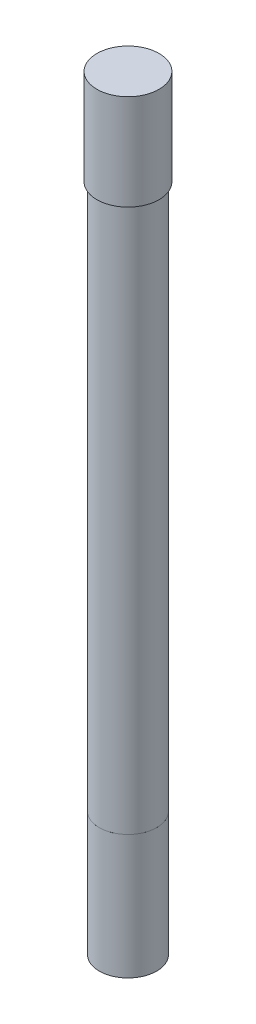
ISO-10303-21;
HEADER;
FILE_DESCRIPTION(('STEP AP214'),'2;1');
FILE_NAME('part.step','',(''),(''),'','','');
FILE_SCHEMA(('AUTOMOTIVE_DESIGN { 1 0 10303 214 1 1 1 1 }'));
ENDSEC;
DATA;
#1=APPLICATION_CONTEXT('core data for automotive mechanical design processes');
#2=APPLICATION_PROTOCOL_DEFINITION('international standard','automotive_design',2000,#1);
#3=PRODUCT_CONTEXT('',#1,'mechanical');
#4=PRODUCT('Part','Part','',(#3));
#5=PRODUCT_RELATED_PRODUCT_CATEGORY('part','',(#4));
#6=PRODUCT_DEFINITION_FORMATION('','',#4);
#7=PRODUCT_DEFINITION_CONTEXT('part definition',#1,'design');
#8=PRODUCT_DEFINITION('design','',#6,#7);
#9=PRODUCT_DEFINITION_SHAPE('','',#8);
#10=(LENGTH_UNIT() NAMED_UNIT(*) SI_UNIT(.MILLI.,.METRE.));
#11=(NAMED_UNIT(*) PLANE_ANGLE_UNIT() SI_UNIT($,.RADIAN.));
#12=(NAMED_UNIT(*) SI_UNIT($,.STERADIAN.) SOLID_ANGLE_UNIT());
#13=UNCERTAINTY_MEASURE_WITH_UNIT(LENGTH_MEASURE(1.E-05),#10,'distance_accuracy_value','');
#14=(GEOMETRIC_REPRESENTATION_CONTEXT(3) GLOBAL_UNCERTAINTY_ASSIGNED_CONTEXT((#13)) GLOBAL_UNIT_ASSIGNED_CONTEXT((#10,
#11,#12)) REPRESENTATION_CONTEXT('',''));
#15=CARTESIAN_POINT('',(0.,0.,0.));
#16=DIRECTION('',(0.,0.,1.));
#17=DIRECTION('',(1.,0.,0.));
#18=AXIS2_PLACEMENT_3D('',#15,#16,#17);
#19=CARTESIAN_POINT('',(0.,160.,0.));
#20=DIRECTION('',(0.,-1.,0.));
#21=DIRECTION('',(0.,0.,-1.));
#22=AXIS2_PLACEMENT_3D('',#19,#20,#21);
#23=CYLINDRICAL_SURFACE('',#22,6.5);
#24=CARTESIAN_POINT('',(0.,160.,0.));
#25=DIRECTION('',(0.,1.,0.));
#26=DIRECTION('',(0.,0.,1.));
#27=AXIS2_PLACEMENT_3D('',#24,#25,#26);
#28=CIRCLE('',#27,6.5);
#29=CARTESIAN_POINT('',(0.,160.,6.5));
#30=VERTEX_POINT('',#29);
#31=EDGE_CURVE('E11',#30,#30,#28,.T.);
#32=ORIENTED_EDGE('',*,*,#31,.F.);
#33=EDGE_LOOP('',(#32));
#34=FACE_BOUND('',#33,.T.);
#35=CARTESIAN_POINT('',(0.,140.,0.));
#36=DIRECTION('',(0.,1.,0.));
#37=DIRECTION('',(0.,0.,1.));
#38=AXIS2_PLACEMENT_3D('',#35,#36,#37);
#39=CIRCLE('',#38,6.5);
#40=CARTESIAN_POINT('',(0.,140.,6.5));
#41=VERTEX_POINT('',#40);
#42=EDGE_CURVE('E60',#41,#41,#39,.T.);
#43=ORIENTED_EDGE('',*,*,#42,.T.);
#44=EDGE_LOOP('',(#43));
#45=FACE_BOUND('',#44,.T.);
#46=ADVANCED_FACE('F53',(#34,#45),#23,.T.);
#47=CARTESIAN_POINT('',(0.,160.,0.));
#48=DIRECTION('',(0.,1.,0.));
#49=DIRECTION('',(0.,0.,1.));
#50=AXIS2_PLACEMENT_3D('',#47,#48,#49);
#51=PLANE('',#50);
#52=ORIENTED_EDGE('',*,*,#31,.T.);
#53=EDGE_LOOP('',(#52));
#54=FACE_BOUND('',#53,.T.);
#55=ADVANCED_FACE('F69',(#54),#51,.T.);
#56=CARTESIAN_POINT('',(0.,140.,0.));
#57=DIRECTION('',(0.,1.,0.));
#58=DIRECTION('',(0.,0.,1.));
#59=AXIS2_PLACEMENT_3D('',#56,#57,#58);
#60=PLANE('',#59);
#61=ORIENTED_EDGE('',*,*,#42,.F.);
#62=EDGE_LOOP('',(#61));
#63=FACE_BOUND('',#62,.T.);
#64=ADVANCED_FACE('F70',(#63),#60,.F.);
#65=CLOSED_SHELL('',(#46,#55,#64));
#66=MANIFOLD_SOLID_BREP('B2',#65);
#67=CARTESIAN_POINT('',(0.,140.,0.));
#68=DIRECTION('',(0.,-1.,0.));
#69=DIRECTION('',(0.,0.,-1.));
#70=AXIS2_PLACEMENT_3D('',#67,#68,#69);
#71=CYLINDRICAL_SURFACE('',#70,6.);
#72=CARTESIAN_POINT('',(0.,140.,0.));
#73=DIRECTION('',(0.,1.,0.));
#74=DIRECTION('',(0.,0.,1.));
#75=AXIS2_PLACEMENT_3D('',#72,#73,#74);
#76=CIRCLE('',#75,6.);
#77=CARTESIAN_POINT('',(0.,140.,-6.));
#78=VERTEX_POINT('',#77);
#79=EDGE_CURVE('E52',#78,#78,#76,.T.);
#80=CARTESIAN_POINT('',(0.,26.,0.));
#81=DIRECTION('',(0.,1.,0.));
#82=DIRECTION('',(0.,0.,1.));
#83=AXIS2_PLACEMENT_3D('',#80,#81,#82);
#84=CIRCLE('',#83,6.);
#85=CARTESIAN_POINT('',(0.,26.,-6.));
#86=VERTEX_POINT('',#85);
#87=EDGE_CURVE('E116',#86,#86,#84,.T.);
#88=CARTESIAN_POINT('',(0.,140.,-6.));
#89=CARTESIAN_POINT('',(0.,138.8125,-6.));
#90=CARTESIAN_POINT('',(0.,137.625,-6.));
#91=CARTESIAN_POINT('',(0.,135.25,-6.));
#92=CARTESIAN_POINT('',(0.,134.0625,-6.));
#93=CARTESIAN_POINT('',(0.,131.6875,-6.));
#94=CARTESIAN_POINT('',(0.,130.5,-6.));
#95=CARTESIAN_POINT('',(0.,128.125,-6.));
#96=CARTESIAN_POINT('',(0.,126.9375,-6.));
#97=CARTESIAN_POINT('',(0.,124.5625,-6.));
#98=CARTESIAN_POINT('',(0.,123.375,-6.));
#99=CARTESIAN_POINT('',(0.,121.,-6.));
#100=CARTESIAN_POINT('',(0.,119.8125,-6.));
#101=CARTESIAN_POINT('',(0.,117.4375,-6.));
#102=CARTESIAN_POINT('',(0.,116.25,-6.));
#103=CARTESIAN_POINT('',(0.,113.875,-6.));
#104=CARTESIAN_POINT('',(0.,112.6875,-6.));
#105=CARTESIAN_POINT('',(0.,110.3125,-6.));
#106=CARTESIAN_POINT('',(0.,109.125,-6.));
#107=CARTESIAN_POINT('',(0.,106.75,-6.));
#108=CARTESIAN_POINT('',(0.,105.5625,-6.));
#109=CARTESIAN_POINT('',(0.,103.1875,-6.));
#110=CARTESIAN_POINT('',(0.,102.,-6.));
#111=CARTESIAN_POINT('',(0.,99.625,-6.));
#112=CARTESIAN_POINT('',(0.,98.4375,-6.));
#113=CARTESIAN_POINT('',(0.,96.0625,-6.));
#114=CARTESIAN_POINT('',(0.,94.875,-6.));
#115=CARTESIAN_POINT('',(0.,92.5,-6.));
#116=CARTESIAN_POINT('',(0.,91.3125,-6.));
#117=CARTESIAN_POINT('',(0.,88.9375,-6.));
#118=CARTESIAN_POINT('',(0.,87.75,-6.));
#119=CARTESIAN_POINT('',(0.,85.375,-6.));
#120=CARTESIAN_POINT('',(0.,84.1875,-6.));
#121=CARTESIAN_POINT('',(0.,81.8125,-6.));
#122=CARTESIAN_POINT('',(0.,80.625,-6.));
#123=CARTESIAN_POINT('',(0.,78.25,-6.));
#124=CARTESIAN_POINT('',(0.,77.0625,-6.));
#125=CARTESIAN_POINT('',(0.,74.6875,-6.));
#126=CARTESIAN_POINT('',(0.,73.5,-6.));
#127=CARTESIAN_POINT('',(0.,71.125,-6.));
#128=CARTESIAN_POINT('',(0.,69.9375,-6.));
#129=CARTESIAN_POINT('',(0.,67.5625,-6.));
#130=CARTESIAN_POINT('',(0.,66.375,-6.));
#131=CARTESIAN_POINT('',(0.,64.,-6.));
#132=CARTESIAN_POINT('',(0.,62.8125,-6.));
#133=CARTESIAN_POINT('',(0.,60.4375,-6.));
#134=CARTESIAN_POINT('',(0.,59.25,-6.));
#135=CARTESIAN_POINT('',(0.,56.875,-6.));
#136=CARTESIAN_POINT('',(0.,55.6875,-6.));
#137=CARTESIAN_POINT('',(0.,53.3125,-6.));
#138=CARTESIAN_POINT('',(0.,52.125,-6.));
#139=CARTESIAN_POINT('',(0.,49.75,-6.));
#140=CARTESIAN_POINT('',(0.,48.5625,-6.));
#141=CARTESIAN_POINT('',(0.,46.1875,-6.));
#142=CARTESIAN_POINT('',(0.,45.,-6.));
#143=CARTESIAN_POINT('',(0.,42.625,-6.));
#144=CARTESIAN_POINT('',(0.,41.4375,-6.));
#145=CARTESIAN_POINT('',(0.,39.0625,-6.));
#146=CARTESIAN_POINT('',(0.,37.875,-6.));
#147=CARTESIAN_POINT('',(0.,35.5,-6.));
#148=CARTESIAN_POINT('',(0.,34.3125,-6.));
#149=CARTESIAN_POINT('',(0.,31.9375,-6.));
#150=CARTESIAN_POINT('',(0.,30.75,-6.));
#151=CARTESIAN_POINT('',(0.,28.375,-6.));
#152=CARTESIAN_POINT('',(0.,27.1875,-6.));
#153=CARTESIAN_POINT('',(0.,26.,-6.));
#154=B_SPLINE_CURVE_WITH_KNOTS('',3,(#88,#89,#90,#91,#92,#93,#94,#95,#96,#97,#98,#99,#100,#101,
#102,#103,#104,#105,#106,#107,#108,#109,#110,#111,#112,#113,#114,#115,#116,#117,#118,#119,#120,
#121,#122,#123,#124,#125,#126,#127,#128,#129,#130,#131,#132,#133,#134,#135,#136,#137,#138,#139,
#140,#141,#142,#143,#144,#145,#146,#147,#148,#149,#150,#151,#152,#153),.UNSPECIFIED.,.F.,.F.,(4,
2,2,2,2,2,2,2,2,2,2,2,2,2,2,2,2,2,2,2,2,2,2,2,2,2,2,2,2,2,2,2,4),(0.,3.5625,7.12499999999999,
10.6875,14.25,17.8125,21.375,24.9375,28.5,32.0625,35.625,39.1875,42.75,46.3125,49.875,53.4375,
57.,60.5625,64.125,67.6875,71.25,74.8125,78.375,81.9375,85.5,89.0625,92.625,96.1875,99.75,
103.3125,106.875,110.4375,114.),.UNSPECIFIED.);
#155=EDGE_CURVE('BSEAM111',#78,#86,#154,.T.);
#156=ORIENTED_EDGE('',*,*,#79,.F.);
#157=ORIENTED_EDGE('',*,*,#87,.T.);
#158=ORIENTED_EDGE('',*,*,#155,.T.);
#159=ORIENTED_EDGE('',*,*,#155,.F.);
#160=EDGE_LOOP('',(#156,#158,#157,#159));
#161=FACE_BOUND('',#160,.T.);
#162=ADVANCED_FACE('F111',(#161),#71,.T.);
#163=CARTESIAN_POINT('',(0.,140.,0.));
#164=DIRECTION('',(0.,1.,0.));
#165=DIRECTION('',(0.,0.,1.));
#166=AXIS2_PLACEMENT_3D('',#163,#164,#165);
#167=PLANE('',#166);
#168=ORIENTED_EDGE('',*,*,#79,.T.);
#169=EDGE_LOOP('',(#168));
#170=FACE_BOUND('',#169,.T.);
#171=ADVANCED_FACE('F129',(#170),#167,.T.);
#172=CARTESIAN_POINT('',(0.,26.,0.));
#173=DIRECTION('',(0.,1.,0.));
#174=DIRECTION('',(0.,0.,1.));
#175=AXIS2_PLACEMENT_3D('',#172,#173,#174);
#176=PLANE('',#175);
#177=ORIENTED_EDGE('',*,*,#87,.F.);
#178=EDGE_LOOP('',(#177));
#179=FACE_BOUND('',#178,.T.);
#180=ADVANCED_FACE('F130',(#179),#176,.F.);
#181=CLOSED_SHELL('',(#162,#171,#180));
#182=MANIFOLD_SOLID_BREP('B6',#181);
#183=CARTESIAN_POINT('',(0.,26.,0.));
#184=DIRECTION('',(0.,-1.,0.));
#185=DIRECTION('',(0.,0.,-1.));
#186=AXIS2_PLACEMENT_3D('',#183,#184,#185);
#187=CYLINDRICAL_SURFACE('',#186,6.);
#188=CARTESIAN_POINT('',(0.,26.,0.));
#189=DIRECTION('',(0.,1.,0.));
#190=DIRECTION('',(0.,0.,1.));
#191=AXIS2_PLACEMENT_3D('',#188,#189,#190);
#192=CIRCLE('',#191,6.);
#193=CARTESIAN_POINT('',(0.,26.,6.));
#194=VERTEX_POINT('',#193);
#195=EDGE_CURVE('E114',#194,#194,#192,.T.);
#196=ORIENTED_EDGE('',*,*,#195,.F.);
#197=EDGE_LOOP('',(#196));
#198=FACE_BOUND('',#197,.T.);
#199=CARTESIAN_POINT('',(0.,0.,0.));
#200=DIRECTION('',(0.,1.,0.));
#201=DIRECTION('',(0.,0.,1.));
#202=AXIS2_PLACEMENT_3D('',#199,#200,#201);
#203=CIRCLE('',#202,6.);
#204=CARTESIAN_POINT('',(0.,0.,6.));
#205=VERTEX_POINT('',#204);
#206=EDGE_CURVE('E168',#205,#205,#203,.T.);
#207=ORIENTED_EDGE('',*,*,#206,.T.);
#208=EDGE_LOOP('',(#207));
#209=FACE_BOUND('',#208,.T.);
#210=ADVANCED_FACE('F170',(#198,#209),#187,.T.);
#211=CARTESIAN_POINT('',(0.,26.,0.));
#212=DIRECTION('',(0.,1.,0.));
#213=DIRECTION('',(0.,0.,1.));
#214=AXIS2_PLACEMENT_3D('',#211,#212,#213);
#215=PLANE('',#214);
#216=ORIENTED_EDGE('',*,*,#195,.T.);
#217=EDGE_LOOP('',(#216));
#218=FACE_BOUND('',#217,.T.);
#219=ADVANCED_FACE('F185',(#218),#215,.T.);
#220=CARTESIAN_POINT('',(0.,0.,0.));
#221=DIRECTION('',(0.,1.,0.));
#222=DIRECTION('',(0.,0.,1.));
#223=AXIS2_PLACEMENT_3D('',#220,#221,#222);
#224=PLANE('',#223);
#225=ORIENTED_EDGE('',*,*,#206,.F.);
#226=EDGE_LOOP('',(#225));
#227=FACE_BOUND('',#226,.T.);
#228=ADVANCED_FACE('F177',(#227),#224,.F.);
#229=CLOSED_SHELL('',(#210,#219,#228));
#230=MANIFOLD_SOLID_BREP('B48',#229);
#231=ADVANCED_BREP_SHAPE_REPRESENTATION('',(#18,#66,#182,#230),#14);
#232=SHAPE_DEFINITION_REPRESENTATION(#9,#231);
ENDSEC;
END-ISO-10303-21;
